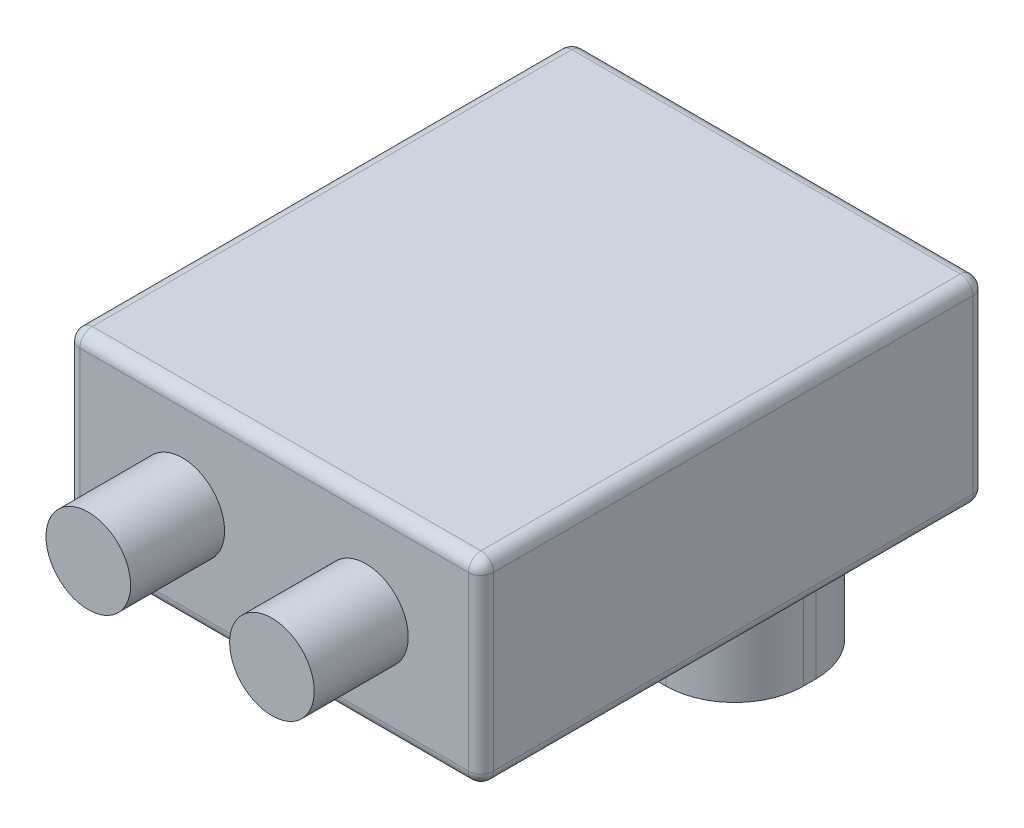
ISO-10303-21;
HEADER;
FILE_DESCRIPTION(('STEP AP214'),'2;1');
FILE_NAME('part.step','',(''),(''),'','','');
FILE_SCHEMA(('AUTOMOTIVE_DESIGN { 1 0 10303 214 1 1 1 1 }'));
ENDSEC;
DATA;
#1=APPLICATION_CONTEXT('core data for automotive mechanical design processes');
#2=APPLICATION_PROTOCOL_DEFINITION('international standard','automotive_design',2000,#1);
#3=PRODUCT_CONTEXT('',#1,'mechanical');
#4=PRODUCT('Part','Part','',(#3));
#5=PRODUCT_RELATED_PRODUCT_CATEGORY('part','',(#4));
#6=PRODUCT_DEFINITION_FORMATION('','',#4);
#7=PRODUCT_DEFINITION_CONTEXT('part definition',#1,'design');
#8=PRODUCT_DEFINITION('design','',#6,#7);
#9=PRODUCT_DEFINITION_SHAPE('','',#8);
#10=(LENGTH_UNIT() NAMED_UNIT(*) SI_UNIT(.MILLI.,.METRE.));
#11=(NAMED_UNIT(*) PLANE_ANGLE_UNIT() SI_UNIT($,.RADIAN.));
#12=(NAMED_UNIT(*) SI_UNIT($,.STERADIAN.) SOLID_ANGLE_UNIT());
#13=UNCERTAINTY_MEASURE_WITH_UNIT(LENGTH_MEASURE(1.E-05),#10,'distance_accuracy_value','');
#14=(GEOMETRIC_REPRESENTATION_CONTEXT(3) GLOBAL_UNCERTAINTY_ASSIGNED_CONTEXT((#13)) GLOBAL_UNIT_ASSIGNED_CONTEXT((#10,
#11,#12)) REPRESENTATION_CONTEXT('',''));
#15=CARTESIAN_POINT('',(0.,0.,0.));
#16=DIRECTION('',(0.,0.,1.));
#17=DIRECTION('',(1.,0.,0.));
#18=AXIS2_PLACEMENT_3D('',#15,#16,#17);
#19=CARTESIAN_POINT('',(0.,0.,0.));
#20=DIRECTION('',(0.,1.,0.));
#21=DIRECTION('',(0.,0.,1.));
#22=AXIS2_PLACEMENT_3D('',#19,#20,#21);
#23=PLANE('',#22);
#24=DIRECTION('',(-1.,0.,0.));
#25=VECTOR('',#24,1.);
#26=CARTESIAN_POINT('',(0.,0.,-38.25));
#27=LINE('',#26,#25);
#28=CARTESIAN_POINT('',(-31.,0.,-38.25));
#29=VERTEX_POINT('',#28);
#30=CARTESIAN_POINT('',(31.,0.,-38.25));
#31=VERTEX_POINT('',#30);
#32=EDGE_CURVE('E250',#29,#31,#27,.F.);
#33=ORIENTED_EDGE('',*,*,#32,.T.);
#34=DIRECTION('',(0.,0.,-1.));
#35=VECTOR('',#34,1.);
#36=CARTESIAN_POINT('',(31.,0.,0.));
#37=LINE('',#36,#35);
#38=CARTESIAN_POINT('',(31.,0.,38.25));
#39=VERTEX_POINT('',#38);
#40=EDGE_CURVE('E253',#31,#39,#37,.F.);
#41=ORIENTED_EDGE('',*,*,#40,.T.);
#42=DIRECTION('',(1.,0.,0.));
#43=VECTOR('',#42,1.);
#44=CARTESIAN_POINT('',(0.,0.,38.25));
#45=LINE('',#44,#43);
#46=CARTESIAN_POINT('',(-31.,0.,38.25));
#47=VERTEX_POINT('',#46);
#48=EDGE_CURVE('E248',#39,#47,#45,.F.);
#49=ORIENTED_EDGE('',*,*,#48,.T.);
#50=DIRECTION('',(0.,0.,1.));
#51=VECTOR('',#50,1.);
#52=CARTESIAN_POINT('',(-31.,0.,0.));
#53=LINE('',#52,#51);
#54=EDGE_CURVE('E246',#47,#29,#53,.F.);
#55=ORIENTED_EDGE('',*,*,#54,.T.);
#56=EDGE_LOOP('',(#33,#41,#49,#55));
#57=FACE_BOUND('',#56,.T.);
#58=DIRECTION('',(0.,0.,-1.));
#59=VECTOR('',#58,1.);
#60=CARTESIAN_POINT('',(-25.,0.,-8.25));
#61=LINE('',#60,#59);
#62=CARTESIAN_POINT('',(-25.,0.,-19.25));
#63=VERTEX_POINT('',#62);
#64=CARTESIAN_POINT('',(-25.,0.,-21.25));
#65=VERTEX_POINT('',#64);
#66=EDGE_CURVE('E322',#63,#65,#61,.T.);
#67=ORIENTED_EDGE('',*,*,#66,.F.);
#68=CARTESIAN_POINT('',(-14.,0.,-19.25));
#69=DIRECTION('',(0.,1.,0.));
#70=DIRECTION('',(0.,0.,1.));
#71=AXIS2_PLACEMENT_3D('',#68,#69,#70);
#72=CIRCLE('',#71,11.);
#73=CARTESIAN_POINT('',(-14.,0.,-8.25));
#74=VERTEX_POINT('',#73);
#75=EDGE_CURVE('E64',#63,#74,#72,.T.);
#76=ORIENTED_EDGE('',*,*,#75,.T.);
#77=DIRECTION('',(-1.,0.,0.));
#78=VECTOR('',#77,1.);
#79=CARTESIAN_POINT('',(-25.,0.,-8.25));
#80=LINE('',#79,#78);
#81=CARTESIAN_POINT('',(14.,0.,-8.25));
#82=VERTEX_POINT('',#81);
#83=EDGE_CURVE('E620',#82,#74,#80,.T.);
#84=ORIENTED_EDGE('',*,*,#83,.F.);
#85=CARTESIAN_POINT('',(14.,0.,-19.25));
#86=DIRECTION('',(0.,1.,0.));
#87=DIRECTION('',(0.,0.,1.));
#88=AXIS2_PLACEMENT_3D('',#85,#86,#87);
#89=CIRCLE('',#88,11.);
#90=CARTESIAN_POINT('',(25.,0.,-19.25));
#91=VERTEX_POINT('',#90);
#92=EDGE_CURVE('E349',#82,#91,#89,.T.);
#93=ORIENTED_EDGE('',*,*,#92,.T.);
#94=DIRECTION('',(0.,0.,1.));
#95=VECTOR('',#94,1.);
#96=CARTESIAN_POINT('',(25.,0.,-8.25));
#97=LINE('',#96,#95);
#98=CARTESIAN_POINT('',(25.,0.,-21.25));
#99=VERTEX_POINT('',#98);
#100=EDGE_CURVE('E599',#99,#91,#97,.T.);
#101=ORIENTED_EDGE('',*,*,#100,.F.);
#102=CARTESIAN_POINT('',(14.,0.,-21.25));
#103=DIRECTION('',(0.,1.,0.));
#104=DIRECTION('',(0.,0.,1.));
#105=AXIS2_PLACEMENT_3D('',#102,#103,#104);
#106=CIRCLE('',#105,11.);
#107=CARTESIAN_POINT('',(14.,0.,-32.25));
#108=VERTEX_POINT('',#107);
#109=EDGE_CURVE('E351',#99,#108,#106,.T.);
#110=ORIENTED_EDGE('',*,*,#109,.T.);
#111=DIRECTION('',(1.,0.,0.));
#112=VECTOR('',#111,1.);
#113=CARTESIAN_POINT('',(-25.,0.,-32.25));
#114=LINE('',#113,#112);
#115=CARTESIAN_POINT('',(-14.,0.,-32.25));
#116=VERTEX_POINT('',#115);
#117=EDGE_CURVE('E594',#116,#108,#114,.T.);
#118=ORIENTED_EDGE('',*,*,#117,.F.);
#119=CARTESIAN_POINT('',(-14.,0.,-21.25));
#120=DIRECTION('',(0.,1.,0.));
#121=DIRECTION('',(0.,0.,1.));
#122=AXIS2_PLACEMENT_3D('',#119,#120,#121);
#123=CIRCLE('',#122,11.);
#124=EDGE_CURVE('E56',#116,#65,#123,.T.);
#125=ORIENTED_EDGE('',*,*,#124,.T.);
#126=EDGE_LOOP('',(#67,#76,#84,#93,#101,#110,#118,#125));
#127=FACE_BOUND('',#126,.T.);
#128=ADVANCED_FACE('F41',(#57,#127),#23,.F.);
#129=CARTESIAN_POINT('',(33.,24.14,-40.25));
#130=DIRECTION('',(-1.,0.,0.));
#131=DIRECTION('',(0.,0.,1.));
#132=AXIS2_PLACEMENT_3D('',#129,#130,#131);
#133=PLANE('',#132);
#134=DIRECTION('',(0.,-1.,0.));
#135=VECTOR('',#134,1.);
#136=CARTESIAN_POINT('',(33.,24.14,38.25));
#137=LINE('',#136,#135);
#138=CARTESIAN_POINT('',(33.,29.44,38.25));
#139=VERTEX_POINT('',#138);
#140=CARTESIAN_POINT('',(33.,2.,38.25));
#141=VERTEX_POINT('',#140);
#142=EDGE_CURVE('E219',#139,#141,#137,.T.);
#143=ORIENTED_EDGE('',*,*,#142,.T.);
#144=DIRECTION('',(0.,0.,-1.));
#145=VECTOR('',#144,1.);
#146=CARTESIAN_POINT('',(33.,2.,-40.25));
#147=LINE('',#146,#145);
#148=CARTESIAN_POINT('',(33.,2.,-38.25));
#149=VERTEX_POINT('',#148);
#150=EDGE_CURVE('E226',#141,#149,#147,.T.);
#151=ORIENTED_EDGE('',*,*,#150,.T.);
#152=DIRECTION('',(0.,-1.,0.));
#153=VECTOR('',#152,1.);
#154=CARTESIAN_POINT('',(33.,24.14,-38.25));
#155=LINE('',#154,#153);
#156=CARTESIAN_POINT('',(33.,29.44,-38.25));
#157=VERTEX_POINT('',#156);
#158=EDGE_CURVE('E187',#149,#157,#155,.F.);
#159=ORIENTED_EDGE('',*,*,#158,.T.);
#160=DIRECTION('',(0.,0.,-1.));
#161=VECTOR('',#160,1.);
#162=CARTESIAN_POINT('',(33.,29.44,40.25));
#163=LINE('',#162,#161);
#164=EDGE_CURVE('E217',#157,#139,#163,.F.);
#165=ORIENTED_EDGE('',*,*,#164,.T.);
#166=EDGE_LOOP('',(#143,#151,#159,#165));
#167=FACE_BOUND('',#166,.T.);
#168=ADVANCED_FACE('F443',(#167),#133,.F.);
#169=CARTESIAN_POINT('',(-33.,24.14,-40.25));
#170=DIRECTION('',(0.,0.,1.));
#171=DIRECTION('',(1.,0.,0.));
#172=AXIS2_PLACEMENT_3D('',#169,#170,#171);
#173=PLANE('',#172);
#174=DIRECTION('',(-1.,0.,0.));
#175=VECTOR('',#174,1.);
#176=CARTESIAN_POINT('',(33.,29.44,-40.25));
#177=LINE('',#176,#175);
#178=CARTESIAN_POINT('',(-31.,29.44,-40.25));
#179=VERTEX_POINT('',#178);
#180=CARTESIAN_POINT('',(31.,29.44,-40.25));
#181=VERTEX_POINT('',#180);
#182=EDGE_CURVE('E215',#179,#181,#177,.F.);
#183=ORIENTED_EDGE('',*,*,#182,.T.);
#184=DIRECTION('',(0.,-1.,0.));
#185=VECTOR('',#184,1.);
#186=CARTESIAN_POINT('',(31.,24.14,-40.25));
#187=LINE('',#186,#185);
#188=CARTESIAN_POINT('',(31.,2.,-40.25));
#189=VERTEX_POINT('',#188);
#190=EDGE_CURVE('E185',#181,#189,#187,.T.);
#191=ORIENTED_EDGE('',*,*,#190,.T.);
#192=DIRECTION('',(-1.,0.,0.));
#193=VECTOR('',#192,1.);
#194=CARTESIAN_POINT('',(-33.,2.,-40.25));
#195=LINE('',#194,#193);
#196=CARTESIAN_POINT('',(-31.,2.,-40.25));
#197=VERTEX_POINT('',#196);
#198=EDGE_CURVE('E204',#189,#197,#195,.T.);
#199=ORIENTED_EDGE('',*,*,#198,.T.);
#200=DIRECTION('',(0.,-1.,0.));
#201=VECTOR('',#200,1.);
#202=CARTESIAN_POINT('',(-31.,24.14,-40.25));
#203=LINE('',#202,#201);
#204=EDGE_CURVE('E210',#197,#179,#203,.F.);
#205=ORIENTED_EDGE('',*,*,#204,.T.);
#206=EDGE_LOOP('',(#183,#191,#199,#205));
#207=FACE_BOUND('',#206,.T.);
#208=ADVANCED_FACE('F213',(#207),#173,.F.);
#209=CARTESIAN_POINT('',(-33.,24.14,-40.25));
#210=DIRECTION('',(1.,0.,0.));
#211=DIRECTION('',(0.,0.,-1.));
#212=AXIS2_PLACEMENT_3D('',#209,#210,#211);
#213=PLANE('',#212);
#214=DIRECTION('',(0.,-1.,0.));
#215=VECTOR('',#214,1.);
#216=CARTESIAN_POINT('',(-33.,24.14,-38.25));
#217=LINE('',#216,#215);
#218=CARTESIAN_POINT('',(-33.,29.44,-38.25));
#219=VERTEX_POINT('',#218);
#220=CARTESIAN_POINT('',(-33.,2.,-38.25));
#221=VERTEX_POINT('',#220);
#222=EDGE_CURVE('E241',#219,#221,#217,.T.);
#223=ORIENTED_EDGE('',*,*,#222,.T.);
#224=DIRECTION('',(0.,0.,1.));
#225=VECTOR('',#224,1.);
#226=CARTESIAN_POINT('',(-33.,2.,-40.25));
#227=LINE('',#226,#225);
#228=CARTESIAN_POINT('',(-33.,2.,38.25));
#229=VERTEX_POINT('',#228);
#230=EDGE_CURVE('E244',#221,#229,#227,.T.);
#231=ORIENTED_EDGE('',*,*,#230,.T.);
#232=DIRECTION('',(0.,-1.,0.));
#233=VECTOR('',#232,1.);
#234=CARTESIAN_POINT('',(-33.,24.14,38.25));
#235=LINE('',#234,#233);
#236=CARTESIAN_POINT('',(-33.,29.44,38.25));
#237=VERTEX_POINT('',#236);
#238=EDGE_CURVE('E239',#229,#237,#235,.F.);
#239=ORIENTED_EDGE('',*,*,#238,.T.);
#240=DIRECTION('',(0.,0.,1.));
#241=VECTOR('',#240,1.);
#242=CARTESIAN_POINT('',(-33.,29.44,-40.25));
#243=LINE('',#242,#241);
#244=EDGE_CURVE('E237',#237,#219,#243,.F.);
#245=ORIENTED_EDGE('',*,*,#244,.T.);
#246=EDGE_LOOP('',(#223,#231,#239,#245));
#247=FACE_BOUND('',#246,.T.);
#248=ADVANCED_FACE('F363',(#247),#213,.F.);
#249=CARTESIAN_POINT('',(-33.,24.14,40.25));
#250=DIRECTION('',(0.,0.,-1.));
#251=DIRECTION('',(-1.,0.,0.));
#252=AXIS2_PLACEMENT_3D('',#249,#250,#251);
#253=PLANE('',#252);
#254=CARTESIAN_POINT('',(14.64999991,15.7200005,40.25));
#255=DIRECTION('',(0.,0.,-1.));
#256=DIRECTION('',(-1.,0.,0.));
#257=AXIS2_PLACEMENT_3D('',#254,#255,#256);
#258=CIRCLE('',#257,6.75);
#259=CARTESIAN_POINT('',(7.89999991,15.7200005,40.25));
#260=VERTEX_POINT('',#259);
#261=EDGE_CURVE('E11',#260,#260,#258,.F.);
#262=ORIENTED_EDGE('',*,*,#261,.F.);
#263=EDGE_LOOP('',(#262));
#264=FACE_BOUND('',#263,.T.);
#265=CARTESIAN_POINT('',(-14.64999991,15.7200005,40.25));
#266=DIRECTION('',(0.,0.,-1.));
#267=DIRECTION('',(-1.,0.,0.));
#268=AXIS2_PLACEMENT_3D('',#265,#266,#267);
#269=CIRCLE('',#268,6.75);
#270=CARTESIAN_POINT('',(-21.39999991,15.7200005,40.25));
#271=VERTEX_POINT('',#270);
#272=EDGE_CURVE('E49',#271,#271,#269,.F.);
#273=ORIENTED_EDGE('',*,*,#272,.F.);
#274=EDGE_LOOP('',(#273));
#275=FACE_BOUND('',#274,.T.);
#276=DIRECTION('',(1.,0.,0.));
#277=VECTOR('',#276,1.);
#278=CARTESIAN_POINT('',(-33.,29.44,40.25));
#279=LINE('',#278,#277);
#280=CARTESIAN_POINT('',(31.,29.44,40.25));
#281=VERTEX_POINT('',#280);
#282=CARTESIAN_POINT('',(-31.,29.44,40.25));
#283=VERTEX_POINT('',#282);
#284=EDGE_CURVE('E259',#281,#283,#279,.F.);
#285=ORIENTED_EDGE('',*,*,#284,.T.);
#286=DIRECTION('',(0.,-1.,0.));
#287=VECTOR('',#286,1.);
#288=CARTESIAN_POINT('',(-31.,24.14,40.25));
#289=LINE('',#288,#287);
#290=CARTESIAN_POINT('',(-31.,2.,40.25));
#291=VERTEX_POINT('',#290);
#292=EDGE_CURVE('E261',#283,#291,#289,.T.);
#293=ORIENTED_EDGE('',*,*,#292,.T.);
#294=DIRECTION('',(1.,0.,0.));
#295=VECTOR('',#294,1.);
#296=CARTESIAN_POINT('',(-33.,2.,40.25));
#297=LINE('',#296,#295);
#298=CARTESIAN_POINT('',(31.,2.,40.25));
#299=VERTEX_POINT('',#298);
#300=EDGE_CURVE('E255',#291,#299,#297,.T.);
#301=ORIENTED_EDGE('',*,*,#300,.T.);
#302=DIRECTION('',(0.,-1.,0.));
#303=VECTOR('',#302,1.);
#304=CARTESIAN_POINT('',(31.,24.14,40.25));
#305=LINE('',#304,#303);
#306=EDGE_CURVE('E257',#299,#281,#305,.F.);
#307=ORIENTED_EDGE('',*,*,#306,.T.);
#308=EDGE_LOOP('',(#285,#293,#301,#307));
#309=FACE_BOUND('',#308,.T.);
#310=ADVANCED_FACE('F359',(#264,#275,#309),#253,.F.);
#311=CARTESIAN_POINT('',(-25.,-19.,-8.25));
#312=DIRECTION('',(1.,0.,0.));
#313=DIRECTION('',(0.,0.,-1.));
#314=AXIS2_PLACEMENT_3D('',#311,#312,#313);
#315=PLANE('',#314);
#316=ORIENTED_EDGE('',*,*,#66,.T.);
#317=DIRECTION('',(0.,1.,0.));
#318=VECTOR('',#317,1.);
#319=CARTESIAN_POINT('',(-25.,-19.,-21.25));
#320=LINE('',#319,#318);
#321=CARTESIAN_POINT('',(-25.,-19.,-21.25));
#322=VERTEX_POINT('',#321);
#323=EDGE_CURVE('E347',#65,#322,#320,.F.);
#324=ORIENTED_EDGE('',*,*,#323,.T.);
#325=DIRECTION('',(0.,0.,-1.));
#326=VECTOR('',#325,1.);
#327=CARTESIAN_POINT('',(-25.,-19.,-8.25));
#328=LINE('',#327,#326);
#329=CARTESIAN_POINT('',(-25.,-19.,-19.25));
#330=VERTEX_POINT('',#329);
#331=EDGE_CURVE('E614',#330,#322,#328,.T.);
#332=ORIENTED_EDGE('',*,*,#331,.F.);
#333=DIRECTION('',(0.,1.,0.));
#334=VECTOR('',#333,1.);
#335=CARTESIAN_POINT('',(-25.,-19.,-19.25));
#336=LINE('',#335,#334);
#337=EDGE_CURVE('E345',#330,#63,#336,.T.);
#338=ORIENTED_EDGE('',*,*,#337,.T.);
#339=EDGE_LOOP('',(#316,#324,#332,#338));
#340=FACE_BOUND('',#339,.T.);
#341=ADVANCED_FACE('F362',(#340),#315,.F.);
#342=CARTESIAN_POINT('',(-25.,-19.,-32.25));
#343=DIRECTION('',(0.,0.,1.));
#344=DIRECTION('',(1.,0.,0.));
#345=AXIS2_PLACEMENT_3D('',#342,#343,#344);
#346=PLANE('',#345);
#347=ORIENTED_EDGE('',*,*,#117,.T.);
#348=DIRECTION('',(0.,1.,0.));
#349=VECTOR('',#348,1.);
#350=CARTESIAN_POINT('',(14.,-19.,-32.25));
#351=LINE('',#350,#349);
#352=CARTESIAN_POINT('',(14.,-19.,-32.25));
#353=VERTEX_POINT('',#352);
#354=EDGE_CURVE('E343',#108,#353,#351,.F.);
#355=ORIENTED_EDGE('',*,*,#354,.T.);
#356=DIRECTION('',(1.,0.,0.));
#357=VECTOR('',#356,1.);
#358=CARTESIAN_POINT('',(-25.,-19.,-32.25));
#359=LINE('',#358,#357);
#360=CARTESIAN_POINT('',(-14.,-19.,-32.25));
#361=VERTEX_POINT('',#360);
#362=EDGE_CURVE('E607',#361,#353,#359,.T.);
#363=ORIENTED_EDGE('',*,*,#362,.F.);
#364=DIRECTION('',(0.,1.,0.));
#365=VECTOR('',#364,1.);
#366=CARTESIAN_POINT('',(-14.,-19.,-32.25));
#367=LINE('',#366,#365);
#368=EDGE_CURVE('E340',#361,#116,#367,.T.);
#369=ORIENTED_EDGE('',*,*,#368,.T.);
#370=EDGE_LOOP('',(#347,#355,#363,#369));
#371=FACE_BOUND('',#370,.T.);
#372=ADVANCED_FACE('F586',(#371),#346,.F.);
#373=CARTESIAN_POINT('',(25.,-19.,-8.25));
#374=DIRECTION('',(-1.,0.,0.));
#375=DIRECTION('',(0.,0.,1.));
#376=AXIS2_PLACEMENT_3D('',#373,#374,#375);
#377=PLANE('',#376);
#378=ORIENTED_EDGE('',*,*,#100,.T.);
#379=DIRECTION('',(0.,1.,0.));
#380=VECTOR('',#379,1.);
#381=CARTESIAN_POINT('',(25.,-19.,-19.25));
#382=LINE('',#381,#380);
#383=CARTESIAN_POINT('',(25.,-19.,-19.25));
#384=VERTEX_POINT('',#383);
#385=EDGE_CURVE('E330',#91,#384,#382,.F.);
#386=ORIENTED_EDGE('',*,*,#385,.T.);
#387=DIRECTION('',(0.,0.,1.));
#388=VECTOR('',#387,1.);
#389=CARTESIAN_POINT('',(25.,-19.,-8.25));
#390=LINE('',#389,#388);
#391=CARTESIAN_POINT('',(25.,-19.,-21.25));
#392=VERTEX_POINT('',#391);
#393=EDGE_CURVE('E605',#392,#384,#390,.T.);
#394=ORIENTED_EDGE('',*,*,#393,.F.);
#395=DIRECTION('',(0.,1.,0.));
#396=VECTOR('',#395,1.);
#397=CARTESIAN_POINT('',(25.,-19.,-21.25));
#398=LINE('',#397,#396);
#399=EDGE_CURVE('E327',#392,#99,#398,.T.);
#400=ORIENTED_EDGE('',*,*,#399,.T.);
#401=EDGE_LOOP('',(#378,#386,#394,#400));
#402=FACE_BOUND('',#401,.T.);
#403=ADVANCED_FACE('F583',(#402),#377,.F.);
#404=CARTESIAN_POINT('',(-25.,-19.,-8.25));
#405=DIRECTION('',(0.,0.,-1.));
#406=DIRECTION('',(-1.,0.,0.));
#407=AXIS2_PLACEMENT_3D('',#404,#405,#406);
#408=PLANE('',#407);
#409=DIRECTION('',(-1.,0.,0.));
#410=VECTOR('',#409,1.);
#411=CARTESIAN_POINT('',(-25.,-19.,-8.25));
#412=LINE('',#411,#410);
#413=CARTESIAN_POINT('',(14.,-19.,-8.25));
#414=VERTEX_POINT('',#413);
#415=CARTESIAN_POINT('',(-14.,-19.,-8.25));
#416=VERTEX_POINT('',#415);
#417=EDGE_CURVE('E211',#414,#416,#412,.T.);
#418=ORIENTED_EDGE('',*,*,#417,.F.);
#419=DIRECTION('',(0.,1.,0.));
#420=VECTOR('',#419,1.);
#421=CARTESIAN_POINT('',(14.,-19.,-8.25));
#422=LINE('',#421,#420);
#423=EDGE_CURVE('E324',#414,#82,#422,.T.);
#424=ORIENTED_EDGE('',*,*,#423,.T.);
#425=ORIENTED_EDGE('',*,*,#83,.T.);
#426=DIRECTION('',(0.,1.,0.));
#427=VECTOR('',#426,1.);
#428=CARTESIAN_POINT('',(-14.,-19.,-8.25));
#429=LINE('',#428,#427);
#430=EDGE_CURVE('E263',#74,#416,#429,.F.);
#431=ORIENTED_EDGE('',*,*,#430,.T.);
#432=EDGE_LOOP('',(#418,#424,#425,#431));
#433=FACE_BOUND('',#432,.T.);
#434=ADVANCED_FACE('F579',(#433),#408,.F.);
#435=CARTESIAN_POINT('',(0.,-19.,0.));
#436=DIRECTION('',(0.,-1.,0.));
#437=DIRECTION('',(0.,0.,-1.));
#438=AXIS2_PLACEMENT_3D('',#435,#436,#437);
#439=PLANE('',#438);
#440=ORIENTED_EDGE('',*,*,#393,.T.);
#441=CARTESIAN_POINT('',(14.,-19.,-19.25));
#442=DIRECTION('',(0.,-1.,0.));
#443=DIRECTION('',(0.,0.,-1.));
#444=AXIS2_PLACEMENT_3D('',#441,#442,#443);
#445=CIRCLE('',#444,11.);
#446=EDGE_CURVE('E338',#384,#414,#445,.T.);
#447=ORIENTED_EDGE('',*,*,#446,.T.);
#448=ORIENTED_EDGE('',*,*,#417,.T.);
#449=CARTESIAN_POINT('',(-14.,-19.,-19.25));
#450=DIRECTION('',(0.,-1.,0.));
#451=DIRECTION('',(0.,0.,-1.));
#452=AXIS2_PLACEMENT_3D('',#449,#450,#451);
#453=CIRCLE('',#452,11.);
#454=EDGE_CURVE('E332',#416,#330,#453,.T.);
#455=ORIENTED_EDGE('',*,*,#454,.T.);
#456=ORIENTED_EDGE('',*,*,#331,.T.);
#457=CARTESIAN_POINT('',(-14.,-19.,-21.25));
#458=DIRECTION('',(0.,-1.,0.));
#459=DIRECTION('',(0.,0.,-1.));
#460=AXIS2_PLACEMENT_3D('',#457,#458,#459);
#461=CIRCLE('',#460,11.);
#462=EDGE_CURVE('E334',#322,#361,#461,.T.);
#463=ORIENTED_EDGE('',*,*,#462,.T.);
#464=ORIENTED_EDGE('',*,*,#362,.T.);
#465=CARTESIAN_POINT('',(14.,-19.,-21.25));
#466=DIRECTION('',(0.,-1.,0.));
#467=DIRECTION('',(0.,0.,-1.));
#468=AXIS2_PLACEMENT_3D('',#465,#466,#467);
#469=CIRCLE('',#468,11.);
#470=EDGE_CURVE('E336',#353,#392,#469,.T.);
#471=ORIENTED_EDGE('',*,*,#470,.T.);
#472=EDGE_LOOP('',(#440,#447,#448,#455,#456,#463,#464,#471));
#473=FACE_BOUND('',#472,.T.);
#474=ADVANCED_FACE('F577',(#473),#439,.T.);
#475=CARTESIAN_POINT('',(0.,31.44,0.));
#476=DIRECTION('',(0.,1.,0.));
#477=DIRECTION('',(0.,0.,1.));
#478=AXIS2_PLACEMENT_3D('',#475,#476,#477);
#479=PLANE('',#478);
#480=DIRECTION('',(1.,0.,0.));
#481=VECTOR('',#480,1.);
#482=CARTESIAN_POINT('',(33.,31.44,38.25));
#483=LINE('',#482,#481);
#484=CARTESIAN_POINT('',(-31.,31.44,38.25));
#485=VERTEX_POINT('',#484);
#486=CARTESIAN_POINT('',(31.,31.44,38.25));
#487=VERTEX_POINT('',#486);
#488=EDGE_CURVE('E230',#485,#487,#483,.T.);
#489=ORIENTED_EDGE('',*,*,#488,.T.);
#490=DIRECTION('',(0.,0.,-1.));
#491=VECTOR('',#490,1.);
#492=CARTESIAN_POINT('',(31.,31.44,-40.25));
#493=LINE('',#492,#491);
#494=CARTESIAN_POINT('',(31.,31.44,-38.25));
#495=VERTEX_POINT('',#494);
#496=EDGE_CURVE('E235',#487,#495,#493,.T.);
#497=ORIENTED_EDGE('',*,*,#496,.T.);
#498=DIRECTION('',(-1.,0.,0.));
#499=VECTOR('',#498,1.);
#500=CARTESIAN_POINT('',(-33.,31.44,-38.25));
#501=LINE('',#500,#499);
#502=CARTESIAN_POINT('',(-31.,31.44,-38.25));
#503=VERTEX_POINT('',#502);
#504=EDGE_CURVE('E232',#495,#503,#501,.T.);
#505=ORIENTED_EDGE('',*,*,#504,.T.);
#506=DIRECTION('',(0.,0.,1.));
#507=VECTOR('',#506,1.);
#508=CARTESIAN_POINT('',(-31.,31.44,40.25));
#509=LINE('',#508,#507);
#510=EDGE_CURVE('E228',#503,#485,#509,.T.);
#511=ORIENTED_EDGE('',*,*,#510,.T.);
#512=EDGE_LOOP('',(#489,#497,#505,#511));
#513=FACE_BOUND('',#512,.T.);
#514=ADVANCED_FACE('F386',(#513),#479,.T.);
#515=CARTESIAN_POINT('',(-31.,24.14,38.25));
#516=DIRECTION('',(0.,-1.,0.));
#517=DIRECTION('',(0.,0.,-1.));
#518=AXIS2_PLACEMENT_3D('',#515,#516,#517);
#519=CYLINDRICAL_SURFACE('',#518,2.);
#520=CARTESIAN_POINT('',(-31.,29.44,38.25));
#521=DIRECTION('',(0.,1.,0.));
#522=DIRECTION('',(0.,0.,1.));
#523=AXIS2_PLACEMENT_3D('',#520,#521,#522);
#524=CIRCLE('',#523,2.);
#525=EDGE_CURVE('E319',#237,#283,#524,.T.);
#526=ORIENTED_EDGE('',*,*,#525,.F.);
#527=ORIENTED_EDGE('',*,*,#238,.F.);
#528=CARTESIAN_POINT('',(-31.,2.,38.25));
#529=DIRECTION('',(0.,-1.,0.));
#530=DIRECTION('',(0.,0.,-1.));
#531=AXIS2_PLACEMENT_3D('',#528,#529,#530);
#532=CIRCLE('',#531,2.);
#533=EDGE_CURVE('E316',#291,#229,#532,.T.);
#534=ORIENTED_EDGE('',*,*,#533,.F.);
#535=ORIENTED_EDGE('',*,*,#292,.F.);
#536=EDGE_LOOP('',(#526,#527,#534,#535));
#537=FACE_BOUND('',#536,.T.);
#538=ADVANCED_FACE('F375',(#537),#519,.T.);
#539=CARTESIAN_POINT('',(-31.,29.44,38.25));
#540=DIRECTION('',(0.,0.,1.));
#541=DIRECTION('',(1.,0.,0.));
#542=AXIS2_PLACEMENT_3D('',#539,#540,#541);
#543=SPHERICAL_SURFACE('',#542,2.);
#544=CARTESIAN_POINT('',(-31.,29.44,38.25));
#545=DIRECTION('',(0.,0.,1.));
#546=DIRECTION('',(1.,0.,0.));
#547=AXIS2_PLACEMENT_3D('',#544,#545,#546);
#548=CIRCLE('',#547,2.);
#549=EDGE_CURVE('E310',#237,#485,#548,.F.);
#550=ORIENTED_EDGE('',*,*,#549,.F.);
#551=ORIENTED_EDGE('',*,*,#525,.T.);
#552=CARTESIAN_POINT('',(-31.,29.44,38.25));
#553=DIRECTION('',(-1.,0.,0.));
#554=DIRECTION('',(0.,0.,1.));
#555=AXIS2_PLACEMENT_3D('',#552,#553,#554);
#556=CIRCLE('',#555,2.);
#557=EDGE_CURVE('E313',#485,#283,#556,.F.);
#558=ORIENTED_EDGE('',*,*,#557,.F.);
#559=EDGE_LOOP('',(#550,#551,#558));
#560=FACE_BOUND('',#559,.T.);
#561=ADVANCED_FACE('F380',(#560),#543,.T.);
#562=CARTESIAN_POINT('',(-31.,2.,38.25));
#563=DIRECTION('',(-1.,0.,0.));
#564=DIRECTION('',(0.,-1.,0.));
#565=AXIS2_PLACEMENT_3D('',#562,#563,#564);
#566=SPHERICAL_SURFACE('',#565,2.);
#567=CARTESIAN_POINT('',(-31.,2.,38.25));
#568=DIRECTION('',(-1.,0.,0.));
#569=DIRECTION('',(0.,0.,1.));
#570=AXIS2_PLACEMENT_3D('',#567,#568,#569);
#571=CIRCLE('',#570,2.);
#572=EDGE_CURVE('E304',#291,#47,#571,.F.);
#573=ORIENTED_EDGE('',*,*,#572,.F.);
#574=ORIENTED_EDGE('',*,*,#533,.T.);
#575=CARTESIAN_POINT('',(-31.,2.,38.25));
#576=DIRECTION('',(0.,0.,1.));
#577=DIRECTION('',(1.,0.,0.));
#578=AXIS2_PLACEMENT_3D('',#575,#576,#577);
#579=CIRCLE('',#578,2.);
#580=EDGE_CURVE('E307',#47,#229,#579,.F.);
#581=ORIENTED_EDGE('',*,*,#580,.F.);
#582=EDGE_LOOP('',(#573,#574,#581));
#583=FACE_BOUND('',#582,.T.);
#584=ADVANCED_FACE('F409',(#583),#566,.T.);
#585=CARTESIAN_POINT('',(0.,29.44,38.25));
#586=DIRECTION('',(-1.,0.,0.));
#587=DIRECTION('',(0.,0.,1.));
#588=AXIS2_PLACEMENT_3D('',#585,#586,#587);
#589=CYLINDRICAL_SURFACE('',#588,2.);
#590=ORIENTED_EDGE('',*,*,#557,.T.);
#591=ORIENTED_EDGE('',*,*,#284,.F.);
#592=CARTESIAN_POINT('',(31.,29.44,38.25));
#593=DIRECTION('',(1.,0.,0.));
#594=DIRECTION('',(0.,0.,-1.));
#595=AXIS2_PLACEMENT_3D('',#592,#593,#594);
#596=CIRCLE('',#595,2.);
#597=EDGE_CURVE('E298',#487,#281,#596,.T.);
#598=ORIENTED_EDGE('',*,*,#597,.F.);
#599=ORIENTED_EDGE('',*,*,#488,.F.);
#600=EDGE_LOOP('',(#590,#591,#598,#599));
#601=FACE_BOUND('',#600,.T.);
#602=ADVANCED_FACE('F383',(#601),#589,.T.);
#603=CARTESIAN_POINT('',(-31.,29.44,0.));
#604=DIRECTION('',(0.,0.,-1.));
#605=DIRECTION('',(-1.,0.,0.));
#606=AXIS2_PLACEMENT_3D('',#603,#604,#605);
#607=CYLINDRICAL_SURFACE('',#606,2.);
#608=ORIENTED_EDGE('',*,*,#549,.T.);
#609=ORIENTED_EDGE('',*,*,#510,.F.);
#610=CARTESIAN_POINT('',(-31.,29.44,-38.25));
#611=DIRECTION('',(0.,0.,-1.));
#612=DIRECTION('',(-1.,0.,0.));
#613=AXIS2_PLACEMENT_3D('',#610,#611,#612);
#614=CIRCLE('',#613,2.);
#615=EDGE_CURVE('E295',#219,#503,#614,.T.);
#616=ORIENTED_EDGE('',*,*,#615,.F.);
#617=ORIENTED_EDGE('',*,*,#244,.F.);
#618=EDGE_LOOP('',(#608,#609,#616,#617));
#619=FACE_BOUND('',#618,.T.);
#620=ADVANCED_FACE('F392',(#619),#607,.T.);
#621=CARTESIAN_POINT('',(-31.,24.14,-38.25));
#622=DIRECTION('',(0.,-1.,0.));
#623=DIRECTION('',(0.,0.,-1.));
#624=AXIS2_PLACEMENT_3D('',#621,#622,#623);
#625=CYLINDRICAL_SURFACE('',#624,2.);
#626=CARTESIAN_POINT('',(-31.,2.,-38.25));
#627=DIRECTION('',(0.,-1.,0.));
#628=DIRECTION('',(0.,0.,-1.));
#629=AXIS2_PLACEMENT_3D('',#626,#627,#628);
#630=CIRCLE('',#629,2.);
#631=EDGE_CURVE('E289',#221,#197,#630,.T.);
#632=ORIENTED_EDGE('',*,*,#631,.F.);
#633=ORIENTED_EDGE('',*,*,#222,.F.);
#634=CARTESIAN_POINT('',(-31.,29.44,-38.25));
#635=DIRECTION('',(0.,1.,0.));
#636=DIRECTION('',(0.,0.,1.));
#637=AXIS2_PLACEMENT_3D('',#634,#635,#636);
#638=CIRCLE('',#637,2.);
#639=EDGE_CURVE('E292',#179,#219,#638,.T.);
#640=ORIENTED_EDGE('',*,*,#639,.F.);
#641=ORIENTED_EDGE('',*,*,#204,.F.);
#642=EDGE_LOOP('',(#632,#633,#640,#641));
#643=FACE_BOUND('',#642,.T.);
#644=ADVANCED_FACE('F398',(#643),#625,.T.);
#645=CARTESIAN_POINT('',(-31.,2.,-40.25));
#646=DIRECTION('',(0.,0.,1.));
#647=DIRECTION('',(1.,0.,0.));
#648=AXIS2_PLACEMENT_3D('',#645,#646,#647);
#649=CYLINDRICAL_SURFACE('',#648,2.);
#650=ORIENTED_EDGE('',*,*,#580,.T.);
#651=ORIENTED_EDGE('',*,*,#230,.F.);
#652=CARTESIAN_POINT('',(-31.,2.,-38.25));
#653=DIRECTION('',(0.,0.,-1.));
#654=DIRECTION('',(-1.,0.,0.));
#655=AXIS2_PLACEMENT_3D('',#652,#653,#654);
#656=CIRCLE('',#655,2.);
#657=EDGE_CURVE('E287',#29,#221,#656,.T.);
#658=ORIENTED_EDGE('',*,*,#657,.F.);
#659=ORIENTED_EDGE('',*,*,#54,.F.);
#660=EDGE_LOOP('',(#650,#651,#658,#659));
#661=FACE_BOUND('',#660,.T.);
#662=ADVANCED_FACE('F404',(#661),#649,.T.);
#663=CARTESIAN_POINT('',(-33.,2.,38.25));
#664=DIRECTION('',(1.,0.,0.));
#665=DIRECTION('',(0.,0.,-1.));
#666=AXIS2_PLACEMENT_3D('',#663,#664,#665);
#667=CYLINDRICAL_SURFACE('',#666,2.);
#668=ORIENTED_EDGE('',*,*,#572,.T.);
#669=ORIENTED_EDGE('',*,*,#48,.F.);
#670=CARTESIAN_POINT('',(31.,2.,38.25));
#671=DIRECTION('',(1.,0.,0.));
#672=DIRECTION('',(0.,0.,-1.));
#673=AXIS2_PLACEMENT_3D('',#670,#671,#672);
#674=CIRCLE('',#673,2.);
#675=EDGE_CURVE('E284',#299,#39,#674,.T.);
#676=ORIENTED_EDGE('',*,*,#675,.F.);
#677=ORIENTED_EDGE('',*,*,#300,.F.);
#678=EDGE_LOOP('',(#668,#669,#676,#677));
#679=FACE_BOUND('',#678,.T.);
#680=ADVANCED_FACE('F412',(#679),#667,.T.);
#681=CARTESIAN_POINT('',(31.,24.14,38.25));
#682=DIRECTION('',(0.,-1.,0.));
#683=DIRECTION('',(0.,0.,-1.));
#684=AXIS2_PLACEMENT_3D('',#681,#682,#683);
#685=CYLINDRICAL_SURFACE('',#684,2.);
#686=CARTESIAN_POINT('',(31.,29.44,38.25));
#687=DIRECTION('',(0.,1.,0.));
#688=DIRECTION('',(0.,0.,1.));
#689=AXIS2_PLACEMENT_3D('',#686,#687,#688);
#690=CIRCLE('',#689,2.);
#691=EDGE_CURVE('E301',#281,#139,#690,.T.);
#692=ORIENTED_EDGE('',*,*,#691,.F.);
#693=ORIENTED_EDGE('',*,*,#306,.F.);
#694=CARTESIAN_POINT('',(31.,2.,38.25));
#695=DIRECTION('',(0.,-1.,0.));
#696=DIRECTION('',(0.,0.,-1.));
#697=AXIS2_PLACEMENT_3D('',#694,#695,#696);
#698=CIRCLE('',#697,2.);
#699=EDGE_CURVE('E281',#141,#299,#698,.T.);
#700=ORIENTED_EDGE('',*,*,#699,.F.);
#701=ORIENTED_EDGE('',*,*,#142,.F.);
#702=EDGE_LOOP('',(#692,#693,#700,#701));
#703=FACE_BOUND('',#702,.T.);
#704=ADVANCED_FACE('F416',(#703),#685,.T.);
#705=CARTESIAN_POINT('',(31.,29.44,38.25));
#706=DIRECTION('',(0.,0.,1.));
#707=DIRECTION('',(1.,0.,0.));
#708=AXIS2_PLACEMENT_3D('',#705,#706,#707);
#709=SPHERICAL_SURFACE('',#708,2.);
#710=ORIENTED_EDGE('',*,*,#597,.T.);
#711=ORIENTED_EDGE('',*,*,#691,.T.);
#712=CARTESIAN_POINT('',(31.,29.44,38.25));
#713=DIRECTION('',(0.,0.,1.));
#714=DIRECTION('',(1.,0.,0.));
#715=AXIS2_PLACEMENT_3D('',#712,#713,#714);
#716=CIRCLE('',#715,2.);
#717=EDGE_CURVE('E278',#487,#139,#716,.F.);
#718=ORIENTED_EDGE('',*,*,#717,.F.);
#719=EDGE_LOOP('',(#710,#711,#718));
#720=FACE_BOUND('',#719,.T.);
#721=ADVANCED_FACE('F420',(#720),#709,.T.);
#722=CARTESIAN_POINT('',(-31.,29.44,-38.25));
#723=DIRECTION('',(-1.,0.,0.));
#724=DIRECTION('',(0.,0.,1.));
#725=AXIS2_PLACEMENT_3D('',#722,#723,#724);
#726=SPHERICAL_SURFACE('',#725,2.);
#727=ORIENTED_EDGE('',*,*,#639,.T.);
#728=ORIENTED_EDGE('',*,*,#615,.T.);
#729=CARTESIAN_POINT('',(-31.,29.44,-38.25));
#730=DIRECTION('',(-1.,0.,0.));
#731=DIRECTION('',(0.,0.,1.));
#732=AXIS2_PLACEMENT_3D('',#729,#730,#731);
#733=CIRCLE('',#732,2.);
#734=EDGE_CURVE('E276',#179,#503,#733,.F.);
#735=ORIENTED_EDGE('',*,*,#734,.F.);
#736=EDGE_LOOP('',(#727,#728,#735));
#737=FACE_BOUND('',#736,.T.);
#738=ADVANCED_FACE('F431',(#737),#726,.T.);
#739=CARTESIAN_POINT('',(-31.,2.,-38.25));
#740=DIRECTION('',(-1.,0.,0.));
#741=DIRECTION('',(0.,-1.,0.));
#742=AXIS2_PLACEMENT_3D('',#739,#740,#741);
#743=SPHERICAL_SURFACE('',#742,2.);
#744=ORIENTED_EDGE('',*,*,#657,.T.);
#745=ORIENTED_EDGE('',*,*,#631,.T.);
#746=CARTESIAN_POINT('',(-31.,2.,-38.25));
#747=DIRECTION('',(-1.,0.,0.));
#748=DIRECTION('',(0.,0.,1.));
#749=AXIS2_PLACEMENT_3D('',#746,#747,#748);
#750=CIRCLE('',#749,2.);
#751=EDGE_CURVE('E207',#29,#197,#750,.F.);
#752=ORIENTED_EDGE('',*,*,#751,.F.);
#753=EDGE_LOOP('',(#744,#745,#752));
#754=FACE_BOUND('',#753,.T.);
#755=ADVANCED_FACE('F433',(#754),#743,.T.);
#756=CARTESIAN_POINT('',(31.,2.,38.25));
#757=DIRECTION('',(0.,0.,1.));
#758=DIRECTION('',(0.,-1.,0.));
#759=AXIS2_PLACEMENT_3D('',#756,#757,#758);
#760=SPHERICAL_SURFACE('',#759,2.);
#761=ORIENTED_EDGE('',*,*,#699,.T.);
#762=ORIENTED_EDGE('',*,*,#675,.T.);
#763=CARTESIAN_POINT('',(31.,2.,38.25));
#764=DIRECTION('',(0.,0.,1.));
#765=DIRECTION('',(1.,0.,0.));
#766=AXIS2_PLACEMENT_3D('',#763,#764,#765);
#767=CIRCLE('',#766,2.);
#768=EDGE_CURVE('E272',#141,#39,#767,.F.);
#769=ORIENTED_EDGE('',*,*,#768,.F.);
#770=EDGE_LOOP('',(#761,#762,#769));
#771=FACE_BOUND('',#770,.T.);
#772=ADVANCED_FACE('F439',(#771),#760,.T.);
#773=CARTESIAN_POINT('',(31.,29.44,0.));
#774=DIRECTION('',(0.,0.,1.));
#775=DIRECTION('',(1.,0.,0.));
#776=AXIS2_PLACEMENT_3D('',#773,#774,#775);
#777=CYLINDRICAL_SURFACE('',#776,2.);
#778=ORIENTED_EDGE('',*,*,#717,.T.);
#779=ORIENTED_EDGE('',*,*,#164,.F.);
#780=CARTESIAN_POINT('',(31.,29.44,-38.25));
#781=DIRECTION('',(0.,0.,-1.));
#782=DIRECTION('',(-1.,0.,0.));
#783=AXIS2_PLACEMENT_3D('',#780,#781,#782);
#784=CIRCLE('',#783,2.);
#785=EDGE_CURVE('E269',#495,#157,#784,.T.);
#786=ORIENTED_EDGE('',*,*,#785,.F.);
#787=ORIENTED_EDGE('',*,*,#496,.F.);
#788=EDGE_LOOP('',(#778,#779,#786,#787));
#789=FACE_BOUND('',#788,.T.);
#790=ADVANCED_FACE('F424',(#789),#777,.T.);
#791=CARTESIAN_POINT('',(0.,29.44,-38.25));
#792=DIRECTION('',(1.,0.,0.));
#793=DIRECTION('',(0.,0.,-1.));
#794=AXIS2_PLACEMENT_3D('',#791,#792,#793);
#795=CYLINDRICAL_SURFACE('',#794,2.);
#796=ORIENTED_EDGE('',*,*,#734,.T.);
#797=ORIENTED_EDGE('',*,*,#504,.F.);
#798=CARTESIAN_POINT('',(31.,29.44,-38.25));
#799=DIRECTION('',(1.,0.,0.));
#800=DIRECTION('',(0.,0.,-1.));
#801=AXIS2_PLACEMENT_3D('',#798,#799,#800);
#802=CIRCLE('',#801,2.);
#803=EDGE_CURVE('E201',#181,#495,#802,.T.);
#804=ORIENTED_EDGE('',*,*,#803,.F.);
#805=ORIENTED_EDGE('',*,*,#182,.F.);
#806=EDGE_LOOP('',(#796,#797,#804,#805));
#807=FACE_BOUND('',#806,.T.);
#808=ADVANCED_FACE('F429',(#807),#795,.T.);
#809=CARTESIAN_POINT('',(-33.,2.,-38.25));
#810=DIRECTION('',(-1.,0.,0.));
#811=DIRECTION('',(0.,0.,1.));
#812=AXIS2_PLACEMENT_3D('',#809,#810,#811);
#813=CYLINDRICAL_SURFACE('',#812,2.);
#814=ORIENTED_EDGE('',*,*,#751,.T.);
#815=ORIENTED_EDGE('',*,*,#198,.F.);
#816=CARTESIAN_POINT('',(31.,2.,-38.25));
#817=DIRECTION('',(1.,0.,0.));
#818=DIRECTION('',(0.,0.,-1.));
#819=AXIS2_PLACEMENT_3D('',#816,#817,#818);
#820=CIRCLE('',#819,2.);
#821=EDGE_CURVE('E193',#31,#189,#820,.T.);
#822=ORIENTED_EDGE('',*,*,#821,.F.);
#823=ORIENTED_EDGE('',*,*,#32,.F.);
#824=EDGE_LOOP('',(#814,#815,#822,#823));
#825=FACE_BOUND('',#824,.T.);
#826=ADVANCED_FACE('F205',(#825),#813,.T.);
#827=CARTESIAN_POINT('',(31.,2.,-40.25));
#828=DIRECTION('',(0.,0.,-1.));
#829=DIRECTION('',(-1.,0.,0.));
#830=AXIS2_PLACEMENT_3D('',#827,#828,#829);
#831=CYLINDRICAL_SURFACE('',#830,2.);
#832=ORIENTED_EDGE('',*,*,#768,.T.);
#833=ORIENTED_EDGE('',*,*,#40,.F.);
#834=CARTESIAN_POINT('',(31.,2.,-38.25));
#835=DIRECTION('',(0.,0.,-1.));
#836=DIRECTION('',(-1.,0.,0.));
#837=AXIS2_PLACEMENT_3D('',#834,#835,#836);
#838=CIRCLE('',#837,2.);
#839=EDGE_CURVE('E197',#149,#31,#838,.T.);
#840=ORIENTED_EDGE('',*,*,#839,.F.);
#841=ORIENTED_EDGE('',*,*,#150,.F.);
#842=EDGE_LOOP('',(#832,#833,#840,#841));
#843=FACE_BOUND('',#842,.T.);
#844=ADVANCED_FACE('F466',(#843),#831,.T.);
#845=CARTESIAN_POINT('',(31.,29.44,-38.25));
#846=DIRECTION('',(0.,1.,0.));
#847=DIRECTION('',(0.,0.,1.));
#848=AXIS2_PLACEMENT_3D('',#845,#846,#847);
#849=SPHERICAL_SURFACE('',#848,2.);
#850=ORIENTED_EDGE('',*,*,#803,.T.);
#851=ORIENTED_EDGE('',*,*,#785,.T.);
#852=CARTESIAN_POINT('',(31.,29.44,-38.25));
#853=DIRECTION('',(0.,1.,0.));
#854=DIRECTION('',(0.,0.,1.));
#855=AXIS2_PLACEMENT_3D('',#852,#853,#854);
#856=CIRCLE('',#855,2.);
#857=EDGE_CURVE('E189',#181,#157,#856,.F.);
#858=ORIENTED_EDGE('',*,*,#857,.F.);
#859=EDGE_LOOP('',(#850,#851,#858));
#860=FACE_BOUND('',#859,.T.);
#861=ADVANCED_FACE('F427',(#860),#849,.T.);
#862=CARTESIAN_POINT('',(31.,2.,-38.25));
#863=DIRECTION('',(0.,-1.,0.));
#864=DIRECTION('',(0.,0.,-1.));
#865=AXIS2_PLACEMENT_3D('',#862,#863,#864);
#866=SPHERICAL_SURFACE('',#865,2.);
#867=ORIENTED_EDGE('',*,*,#839,.T.);
#868=ORIENTED_EDGE('',*,*,#821,.T.);
#869=CARTESIAN_POINT('',(31.,2.,-38.25));
#870=DIRECTION('',(0.,-1.,0.));
#871=DIRECTION('',(0.,0.,-1.));
#872=AXIS2_PLACEMENT_3D('',#869,#870,#871);
#873=CIRCLE('',#872,2.);
#874=EDGE_CURVE('E181',#149,#189,#873,.F.);
#875=ORIENTED_EDGE('',*,*,#874,.F.);
#876=EDGE_LOOP('',(#867,#868,#875));
#877=FACE_BOUND('',#876,.T.);
#878=ADVANCED_FACE('F195',(#877),#866,.T.);
#879=CARTESIAN_POINT('',(31.,24.14,-38.25));
#880=DIRECTION('',(0.,-1.,0.));
#881=DIRECTION('',(0.,0.,-1.));
#882=AXIS2_PLACEMENT_3D('',#879,#880,#881);
#883=CYLINDRICAL_SURFACE('',#882,2.);
#884=ORIENTED_EDGE('',*,*,#857,.T.);
#885=ORIENTED_EDGE('',*,*,#158,.F.);
#886=ORIENTED_EDGE('',*,*,#874,.T.);
#887=ORIENTED_EDGE('',*,*,#190,.F.);
#888=EDGE_LOOP('',(#884,#885,#886,#887));
#889=FACE_BOUND('',#888,.T.);
#890=ADVANCED_FACE('F183',(#889),#883,.T.);
#891=CARTESIAN_POINT('',(14.,-19.,-19.25));
#892=DIRECTION('',(0.,1.,0.));
#893=DIRECTION('',(0.,0.,1.));
#894=AXIS2_PLACEMENT_3D('',#891,#892,#893);
#895=CYLINDRICAL_SURFACE('',#894,11.);
#896=ORIENTED_EDGE('',*,*,#446,.F.);
#897=ORIENTED_EDGE('',*,*,#385,.F.);
#898=ORIENTED_EDGE('',*,*,#92,.F.);
#899=ORIENTED_EDGE('',*,*,#423,.F.);
#900=EDGE_LOOP('',(#896,#897,#898,#899));
#901=FACE_BOUND('',#900,.T.);
#902=ADVANCED_FACE('F461',(#901),#895,.T.);
#903=CARTESIAN_POINT('',(14.,-19.,-21.25));
#904=DIRECTION('',(0.,1.,0.));
#905=DIRECTION('',(0.,0.,1.));
#906=AXIS2_PLACEMENT_3D('',#903,#904,#905);
#907=CYLINDRICAL_SURFACE('',#906,11.);
#908=ORIENTED_EDGE('',*,*,#470,.F.);
#909=ORIENTED_EDGE('',*,*,#354,.F.);
#910=ORIENTED_EDGE('',*,*,#109,.F.);
#911=ORIENTED_EDGE('',*,*,#399,.F.);
#912=EDGE_LOOP('',(#908,#909,#910,#911));
#913=FACE_BOUND('',#912,.T.);
#914=ADVANCED_FACE('F519',(#913),#907,.T.);
#915=CARTESIAN_POINT('',(-14.,-19.,-21.25));
#916=DIRECTION('',(0.,1.,0.));
#917=DIRECTION('',(0.,0.,1.));
#918=AXIS2_PLACEMENT_3D('',#915,#916,#917);
#919=CYLINDRICAL_SURFACE('',#918,11.);
#920=ORIENTED_EDGE('',*,*,#462,.F.);
#921=ORIENTED_EDGE('',*,*,#323,.F.);
#922=ORIENTED_EDGE('',*,*,#124,.F.);
#923=ORIENTED_EDGE('',*,*,#368,.F.);
#924=EDGE_LOOP('',(#920,#921,#922,#923));
#925=FACE_BOUND('',#924,.T.);
#926=ADVANCED_FACE('F528',(#925),#919,.T.);
#927=CARTESIAN_POINT('',(-14.,-19.,-19.25));
#928=DIRECTION('',(0.,1.,0.));
#929=DIRECTION('',(0.,0.,1.));
#930=AXIS2_PLACEMENT_3D('',#927,#928,#929);
#931=CYLINDRICAL_SURFACE('',#930,11.);
#932=ORIENTED_EDGE('',*,*,#454,.F.);
#933=ORIENTED_EDGE('',*,*,#430,.F.);
#934=ORIENTED_EDGE('',*,*,#75,.F.);
#935=ORIENTED_EDGE('',*,*,#337,.F.);
#936=EDGE_LOOP('',(#932,#933,#934,#935));
#937=FACE_BOUND('',#936,.T.);
#938=ADVANCED_FACE('F43',(#937),#931,.T.);
#939=CARTESIAN_POINT('',(-14.64999991,15.7200005,55.25));
#940=DIRECTION('',(0.,0.,-1.));
#941=DIRECTION('',(-1.,0.,0.));
#942=AXIS2_PLACEMENT_3D('',#939,#940,#941);
#943=CYLINDRICAL_SURFACE('',#942,6.75);
#944=CARTESIAN_POINT('',(-14.64999991,15.7200005,55.25));
#945=DIRECTION('',(0.,0.,1.));
#946=DIRECTION('',(1.,0.,0.));
#947=AXIS2_PLACEMENT_3D('',#944,#945,#946);
#948=CIRCLE('',#947,6.75);
#949=CARTESIAN_POINT('',(-7.89999991,15.7200005,55.25));
#950=VERTEX_POINT('',#949);
#951=EDGE_CURVE('E190',#950,#950,#948,.T.);
#952=ORIENTED_EDGE('',*,*,#951,.F.);
#953=EDGE_LOOP('',(#952));
#954=FACE_BOUND('',#953,.T.);
#955=ORIENTED_EDGE('',*,*,#272,.T.);
#956=EDGE_LOOP('',(#955));
#957=FACE_BOUND('',#956,.T.);
#958=ADVANCED_FACE('F357',(#954,#957),#943,.T.);
#959=CARTESIAN_POINT('',(-14.64999991,15.7200005,55.25));
#960=DIRECTION('',(0.,0.,1.));
#961=DIRECTION('',(1.,0.,0.));
#962=AXIS2_PLACEMENT_3D('',#959,#960,#961);
#963=PLANE('',#962);
#964=ORIENTED_EDGE('',*,*,#951,.T.);
#965=EDGE_LOOP('',(#964));
#966=FACE_BOUND('',#965,.T.);
#967=ADVANCED_FACE('F547',(#966),#963,.T.);
#968=CARTESIAN_POINT('',(14.64999991,15.7200005,55.25));
#969=DIRECTION('',(0.,0.,-1.));
#970=DIRECTION('',(-1.,0.,0.));
#971=AXIS2_PLACEMENT_3D('',#968,#969,#970);
#972=CYLINDRICAL_SURFACE('',#971,6.75);
#973=CARTESIAN_POINT('',(14.64999991,15.7200005,55.25));
#974=DIRECTION('',(0.,0.,1.));
#975=DIRECTION('',(-1.,0.,0.));
#976=AXIS2_PLACEMENT_3D('',#973,#974,#975);
#977=CIRCLE('',#976,6.75);
#978=CARTESIAN_POINT('',(7.89999991,15.7200005,55.25));
#979=VERTEX_POINT('',#978);
#980=EDGE_CURVE('E629',#979,#979,#977,.T.);
#981=ORIENTED_EDGE('',*,*,#980,.F.);
#982=EDGE_LOOP('',(#981));
#983=FACE_BOUND('',#982,.T.);
#984=ORIENTED_EDGE('',*,*,#261,.T.);
#985=EDGE_LOOP('',(#984));
#986=FACE_BOUND('',#985,.T.);
#987=ADVANCED_FACE('F555',(#983,#986),#972,.T.);
#988=CARTESIAN_POINT('',(14.64999991,15.7200005,55.25));
#989=DIRECTION('',(0.,0.,-1.));
#990=DIRECTION('',(-1.,0.,0.));
#991=AXIS2_PLACEMENT_3D('',#988,#989,#990);
#992=PLANE('',#991);
#993=ORIENTED_EDGE('',*,*,#980,.T.);
#994=EDGE_LOOP('',(#993));
#995=FACE_BOUND('',#994,.T.);
#996=ADVANCED_FACE('F563',(#995),#992,.F.);
#997=CLOSED_SHELL('',(#128,#168,#208,#248,#310,#341,#372,#403,#434,#474,#514,#538,#561,#584,
#602,#620,#644,#662,#680,#704,#721,#738,#755,#772,#790,#808,#826,#844,#861,#878,#890,#902,#914,
#926,#938,#958,#967,#987,#996));
#998=MANIFOLD_SOLID_BREP('B2',#997);
#999=ADVANCED_BREP_SHAPE_REPRESENTATION('',(#18,#998),#14);
#1000=SHAPE_DEFINITION_REPRESENTATION(#9,#999);
ENDSEC;
END-ISO-10303-21;
